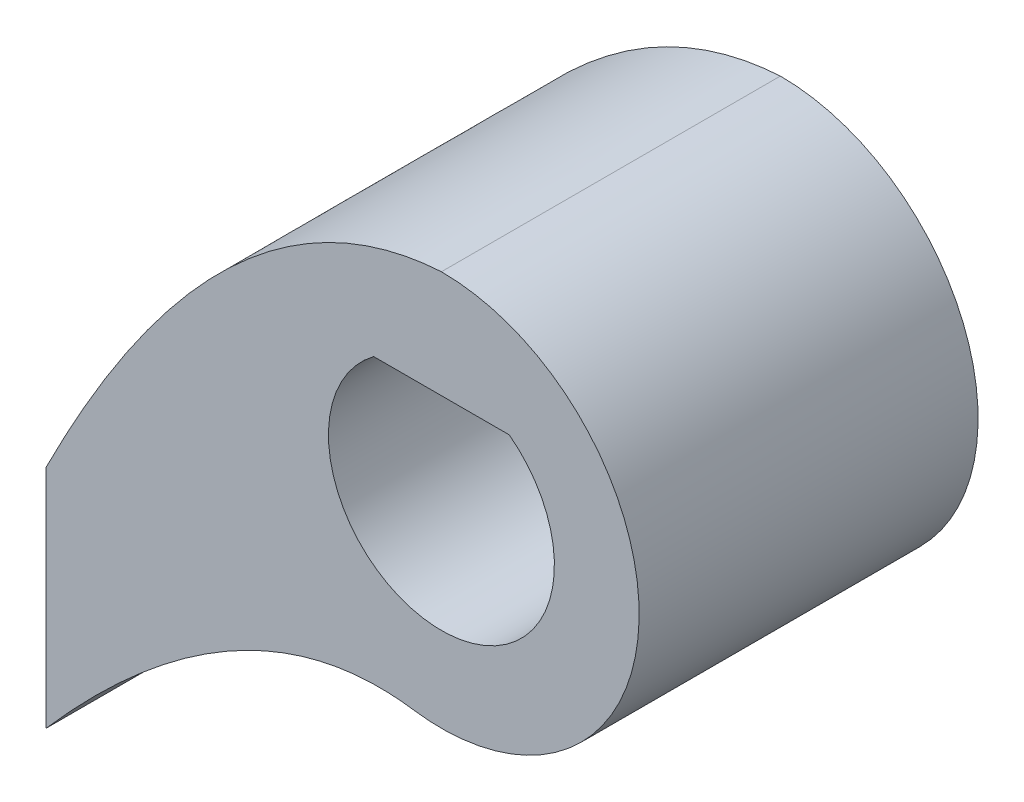
ISO-10303-21;
HEADER;
FILE_DESCRIPTION(('STEP AP214'),'2;1');
FILE_NAME('part.step','',(''),(''),'','','');
FILE_SCHEMA(('AUTOMOTIVE_DESIGN { 1 0 10303 214 1 1 1 1 }'));
ENDSEC;
DATA;
#1=APPLICATION_CONTEXT('core data for automotive mechanical design processes');
#2=APPLICATION_PROTOCOL_DEFINITION('international standard','automotive_design',2000,#1);
#3=PRODUCT_CONTEXT('',#1,'mechanical');
#4=PRODUCT('Part','Part','',(#3));
#5=PRODUCT_RELATED_PRODUCT_CATEGORY('part','',(#4));
#6=PRODUCT_DEFINITION_FORMATION('','',#4);
#7=PRODUCT_DEFINITION_CONTEXT('part definition',#1,'design');
#8=PRODUCT_DEFINITION('design','',#6,#7);
#9=PRODUCT_DEFINITION_SHAPE('','',#8);
#10=(LENGTH_UNIT() NAMED_UNIT(*) SI_UNIT(.MILLI.,.METRE.));
#11=(NAMED_UNIT(*) PLANE_ANGLE_UNIT() SI_UNIT($,.RADIAN.));
#12=(NAMED_UNIT(*) SI_UNIT($,.STERADIAN.) SOLID_ANGLE_UNIT());
#13=UNCERTAINTY_MEASURE_WITH_UNIT(LENGTH_MEASURE(1.E-05),#10,'distance_accuracy_value','');
#14=(GEOMETRIC_REPRESENTATION_CONTEXT(3) GLOBAL_UNCERTAINTY_ASSIGNED_CONTEXT((#13)) GLOBAL_UNIT_ASSIGNED_CONTEXT((#10,
#11,#12)) REPRESENTATION_CONTEXT('',''));
#15=CARTESIAN_POINT('',(0.,0.,0.));
#16=DIRECTION('',(0.,0.,1.));
#17=DIRECTION('',(1.,0.,0.));
#18=AXIS2_PLACEMENT_3D('',#15,#16,#17);
#19=CARTESIAN_POINT('',(-3.64170922116727,-4.12915809207249,6.));
#20=DIRECTION('',(0.,0.,1.));
#21=DIRECTION('',(1.,0.,0.));
#22=AXIS2_PLACEMENT_3D('',#19,#20,#21);
#23=PLANE('',#22);
#24=CARTESIAN_POINT('',(-7.,-7.,6.));
#25=CARTESIAN_POINT('',(-3.53341844233453,-3.0262653765761,6.));
#26=CARTESIAN_POINT('',(-0.5,-3.46410161513775,6.));
#27=B_SPLINE_CURVE_WITH_KNOTS('',2,(#24,#25,#26),.UNSPECIFIED.,.F.,.F.,(3,3),(0.,
0.361848159329166),.UNSPECIFIED.);
#28=CARTESIAN_POINT('',(-7.,-7.,6.));
#29=VERTEX_POINT('',#28);
#30=CARTESIAN_POINT('',(-0.500000000000002,-3.46410161513775,6.));
#31=VERTEX_POINT('',#30);
#32=EDGE_CURVE('E108',#29,#31,#27,.T.);
#33=ORIENTED_EDGE('',*,*,#32,.T.);
#34=CARTESIAN_POINT('',(0.,0.,6.));
#35=DIRECTION('',(0.,0.,1.));
#36=DIRECTION('',(1.,0.,0.));
#37=AXIS2_PLACEMENT_3D('',#34,#35,#36);
#38=CIRCLE('',#37,3.5);
#39=CARTESIAN_POINT('',(0.,3.5,6.));
#40=VERTEX_POINT('',#39);
#41=EDGE_CURVE('E114',#31,#40,#38,.T.);
#42=ORIENTED_EDGE('',*,*,#41,.T.);
#43=CARTESIAN_POINT('',(0.,3.5,6.));
#44=CARTESIAN_POINT('',(-3.84641453313255,3.27126829641687,6.));
#45=CARTESIAN_POINT('',(-7.,-3.,6.));
#46=B_SPLINE_CURVE_WITH_KNOTS('',2,(#43,#44,#45),.UNSPECIFIED.,.F.,.F.,(3,3),(0.,
0.663529029496582),.UNSPECIFIED.);
#47=CARTESIAN_POINT('',(-7.,-3.,6.));
#48=VERTEX_POINT('',#47);
#49=EDGE_CURVE('E120',#40,#48,#46,.T.);
#50=ORIENTED_EDGE('',*,*,#49,.T.);
#51=DIRECTION('',(0.,-1.,0.));
#52=VECTOR('',#51,1.);
#53=CARTESIAN_POINT('',(-7.,-7.,6.));
#54=LINE('',#53,#52);
#55=EDGE_CURVE('E125',#48,#29,#54,.T.);
#56=ORIENTED_EDGE('',*,*,#55,.T.);
#57=EDGE_LOOP('',(#33,#42,#50,#56));
#58=FACE_BOUND('',#57,.T.);
#59=DIRECTION('',(-1.,0.,0.));
#60=VECTOR('',#59,1.);
#61=CARTESIAN_POINT('',(1.2,1.6,6.));
#62=LINE('',#61,#60);
#63=CARTESIAN_POINT('',(1.2,1.6,6.));
#64=VERTEX_POINT('',#63);
#65=CARTESIAN_POINT('',(-1.2,1.6,6.));
#66=VERTEX_POINT('',#65);
#67=EDGE_CURVE('E92',#64,#66,#62,.T.);
#68=ORIENTED_EDGE('',*,*,#67,.F.);
#69=CARTESIAN_POINT('',(0.,0.,6.));
#70=DIRECTION('',(0.,0.,1.));
#71=DIRECTION('',(1.,0.,0.));
#72=AXIS2_PLACEMENT_3D('',#69,#70,#71);
#73=CIRCLE('',#72,2.);
#74=EDGE_CURVE('E98',#66,#64,#73,.T.);
#75=ORIENTED_EDGE('',*,*,#74,.F.);
#76=EDGE_LOOP('',(#68,#75));
#77=FACE_BOUND('',#76,.T.);
#78=ADVANCED_FACE('F39',(#58,#77),#23,.T.);
#79=CARTESIAN_POINT('',(-3.64170922116727,-4.12915809207249,0.));
#80=DIRECTION('',(0.,0.,1.));
#81=DIRECTION('',(1.,0.,0.));
#82=AXIS2_PLACEMENT_3D('',#79,#80,#81);
#83=PLANE('',#82);
#84=CARTESIAN_POINT('',(-7.,-7.,0.));
#85=CARTESIAN_POINT('',(-3.53341844233453,-3.0262653765761,0.));
#86=CARTESIAN_POINT('',(-0.5,-3.46410161513775,0.));
#87=B_SPLINE_CURVE_WITH_KNOTS('',2,(#84,#85,#86),.UNSPECIFIED.,.F.,.F.,(3,3),(0.,
0.361848159329166),.UNSPECIFIED.);
#88=CARTESIAN_POINT('',(-7.,-7.,0.));
#89=VERTEX_POINT('',#88);
#90=CARTESIAN_POINT('',(-0.500000000000002,-3.46410161513775,0.));
#91=VERTEX_POINT('',#90);
#92=EDGE_CURVE('E107',#89,#91,#87,.T.);
#93=ORIENTED_EDGE('',*,*,#92,.F.);
#94=DIRECTION('',(0.,-1.,0.));
#95=VECTOR('',#94,1.);
#96=CARTESIAN_POINT('',(-7.,-7.,0.));
#97=LINE('',#96,#95);
#98=CARTESIAN_POINT('',(-7.,-3.,0.));
#99=VERTEX_POINT('',#98);
#100=EDGE_CURVE('E115',#99,#89,#97,.T.);
#101=ORIENTED_EDGE('',*,*,#100,.F.);
#102=CARTESIAN_POINT('',(0.,3.5,0.));
#103=CARTESIAN_POINT('',(-3.84641453313255,3.27126829641687,0.));
#104=CARTESIAN_POINT('',(-7.,-3.,0.));
#105=B_SPLINE_CURVE_WITH_KNOTS('',2,(#102,#103,#104),.UNSPECIFIED.,.F.,.F.,(3,3),(0.,
0.663529029496582),.UNSPECIFIED.);
#106=CARTESIAN_POINT('',(0.,3.5,0.));
#107=VERTEX_POINT('',#106);
#108=EDGE_CURVE('E213',#107,#99,#105,.T.);
#109=ORIENTED_EDGE('',*,*,#108,.F.);
#110=CARTESIAN_POINT('',(0.,0.,0.));
#111=DIRECTION('',(0.,0.,1.));
#112=DIRECTION('',(1.,0.,0.));
#113=AXIS2_PLACEMENT_3D('',#110,#111,#112);
#114=CIRCLE('',#113,3.5);
#115=EDGE_CURVE('E219',#91,#107,#114,.T.);
#116=ORIENTED_EDGE('',*,*,#115,.F.);
#117=EDGE_LOOP('',(#93,#101,#109,#116));
#118=FACE_BOUND('',#117,.T.);
#119=CARTESIAN_POINT('',(0.,0.,0.));
#120=DIRECTION('',(0.,0.,1.));
#121=DIRECTION('',(1.,0.,0.));
#122=AXIS2_PLACEMENT_3D('',#119,#120,#121);
#123=CIRCLE('',#122,2.);
#124=CARTESIAN_POINT('',(-1.2,1.6,0.));
#125=VERTEX_POINT('',#124);
#126=CARTESIAN_POINT('',(1.2,1.6,0.));
#127=VERTEX_POINT('',#126);
#128=EDGE_CURVE('E62',#125,#127,#123,.T.);
#129=ORIENTED_EDGE('',*,*,#128,.T.);
#130=DIRECTION('',(-1.,0.,0.));
#131=VECTOR('',#130,1.);
#132=CARTESIAN_POINT('',(1.2,1.6,0.));
#133=LINE('',#132,#131);
#134=EDGE_CURVE('E102',#127,#125,#133,.T.);
#135=ORIENTED_EDGE('',*,*,#134,.T.);
#136=EDGE_LOOP('',(#129,#135));
#137=FACE_BOUND('',#136,.T.);
#138=ADVANCED_FACE('F143',(#118,#137),#83,.F.);
#139=DIRECTION('',(0.,0.,-1.));
#140=VECTOR('',#139,1.);
#141=SURFACE_OF_LINEAR_EXTRUSION('',#27,#140);
#142=ORIENTED_EDGE('',*,*,#92,.T.);
#143=DIRECTION('',(0.,0.,-1.));
#144=VECTOR('',#143,1.);
#145=CARTESIAN_POINT('',(-0.500000000000002,-3.46410161513775,6.));
#146=LINE('',#145,#144);
#147=EDGE_CURVE('E11',#31,#91,#146,.T.);
#148=ORIENTED_EDGE('',*,*,#147,.F.);
#149=ORIENTED_EDGE('',*,*,#32,.F.);
#150=DIRECTION('',(0.,0.,-1.));
#151=VECTOR('',#150,1.);
#152=CARTESIAN_POINT('',(-7.,-7.,6.));
#153=LINE('',#152,#151);
#154=EDGE_CURVE('E207',#29,#89,#153,.T.);
#155=ORIENTED_EDGE('',*,*,#154,.T.);
#156=EDGE_LOOP('',(#142,#148,#149,#155));
#157=FACE_BOUND('',#156,.T.);
#158=ADVANCED_FACE('F41',(#157),#141,.F.);
#159=CARTESIAN_POINT('',(0.,0.,6.));
#160=DIRECTION('',(0.,0.,-1.));
#161=DIRECTION('',(-1.,0.,0.));
#162=AXIS2_PLACEMENT_3D('',#159,#160,#161);
#163=CYLINDRICAL_SURFACE('',#162,3.5);
#164=ORIENTED_EDGE('',*,*,#115,.T.);
#165=DIRECTION('',(0.,0.,-1.));
#166=VECTOR('',#165,1.);
#167=CARTESIAN_POINT('',(0.,3.5,6.));
#168=LINE('',#167,#166);
#169=EDGE_CURVE('E48',#40,#107,#168,.T.);
#170=ORIENTED_EDGE('',*,*,#169,.F.);
#171=ORIENTED_EDGE('',*,*,#41,.F.);
#172=ORIENTED_EDGE('',*,*,#147,.T.);
#173=EDGE_LOOP('',(#164,#170,#171,#172));
#174=FACE_BOUND('',#173,.T.);
#175=ADVANCED_FACE('F135',(#174),#163,.T.);
#176=DIRECTION('',(0.,0.,-1.));
#177=VECTOR('',#176,1.);
#178=SURFACE_OF_LINEAR_EXTRUSION('',#46,#177);
#179=ORIENTED_EDGE('',*,*,#108,.T.);
#180=DIRECTION('',(0.,0.,-1.));
#181=VECTOR('',#180,1.);
#182=CARTESIAN_POINT('',(-7.,-3.,6.));
#183=LINE('',#182,#181);
#184=EDGE_CURVE('E210',#48,#99,#183,.T.);
#185=ORIENTED_EDGE('',*,*,#184,.F.);
#186=ORIENTED_EDGE('',*,*,#49,.F.);
#187=ORIENTED_EDGE('',*,*,#169,.T.);
#188=EDGE_LOOP('',(#179,#185,#186,#187));
#189=FACE_BOUND('',#188,.T.);
#190=ADVANCED_FACE('F131',(#189),#178,.F.);
#191=CARTESIAN_POINT('',(-7.,-7.,6.));
#192=DIRECTION('',(1.,0.,0.));
#193=DIRECTION('',(0.,0.,-1.));
#194=AXIS2_PLACEMENT_3D('',#191,#192,#193);
#195=PLANE('',#194);
#196=ORIENTED_EDGE('',*,*,#100,.T.);
#197=ORIENTED_EDGE('',*,*,#154,.F.);
#198=ORIENTED_EDGE('',*,*,#55,.F.);
#199=ORIENTED_EDGE('',*,*,#184,.T.);
#200=EDGE_LOOP('',(#196,#197,#198,#199));
#201=FACE_BOUND('',#200,.T.);
#202=ADVANCED_FACE('F134',(#201),#195,.F.);
#203=CARTESIAN_POINT('',(0.,0.,6.));
#204=DIRECTION('',(0.,0.,-1.));
#205=DIRECTION('',(-1.,0.,0.));
#206=AXIS2_PLACEMENT_3D('',#203,#204,#205);
#207=CYLINDRICAL_SURFACE('',#206,2.);
#208=ORIENTED_EDGE('',*,*,#128,.F.);
#209=DIRECTION('',(0.,0.,-1.));
#210=VECTOR('',#209,1.);
#211=CARTESIAN_POINT('',(-1.2,1.6,6.));
#212=LINE('',#211,#210);
#213=EDGE_CURVE('E94',#66,#125,#212,.T.);
#214=ORIENTED_EDGE('',*,*,#213,.F.);
#215=ORIENTED_EDGE('',*,*,#74,.T.);
#216=DIRECTION('',(0.,0.,-1.));
#217=VECTOR('',#216,1.);
#218=CARTESIAN_POINT('',(1.2,1.6,6.));
#219=LINE('',#218,#217);
#220=EDGE_CURVE('E55',#64,#127,#219,.T.);
#221=ORIENTED_EDGE('',*,*,#220,.T.);
#222=EDGE_LOOP('',(#208,#214,#215,#221));
#223=FACE_BOUND('',#222,.T.);
#224=ADVANCED_FACE('F100',(#223),#207,.F.);
#225=CARTESIAN_POINT('',(1.2,1.6,6.));
#226=DIRECTION('',(0.,-1.,0.));
#227=DIRECTION('',(0.,0.,-1.));
#228=AXIS2_PLACEMENT_3D('',#225,#226,#227);
#229=PLANE('',#228);
#230=ORIENTED_EDGE('',*,*,#134,.F.);
#231=ORIENTED_EDGE('',*,*,#220,.F.);
#232=ORIENTED_EDGE('',*,*,#67,.T.);
#233=ORIENTED_EDGE('',*,*,#213,.T.);
#234=EDGE_LOOP('',(#230,#231,#232,#233));
#235=FACE_BOUND('',#234,.T.);
#236=ADVANCED_FACE('F93',(#235),#229,.T.);
#237=CLOSED_SHELL('',(#78,#138,#158,#175,#190,#202,#224,#236));
#238=MANIFOLD_SOLID_BREP('B2',#237);
#239=ADVANCED_BREP_SHAPE_REPRESENTATION('',(#18,#238),#14);
#240=SHAPE_DEFINITION_REPRESENTATION(#9,#239);
ENDSEC;
END-ISO-10303-21;
